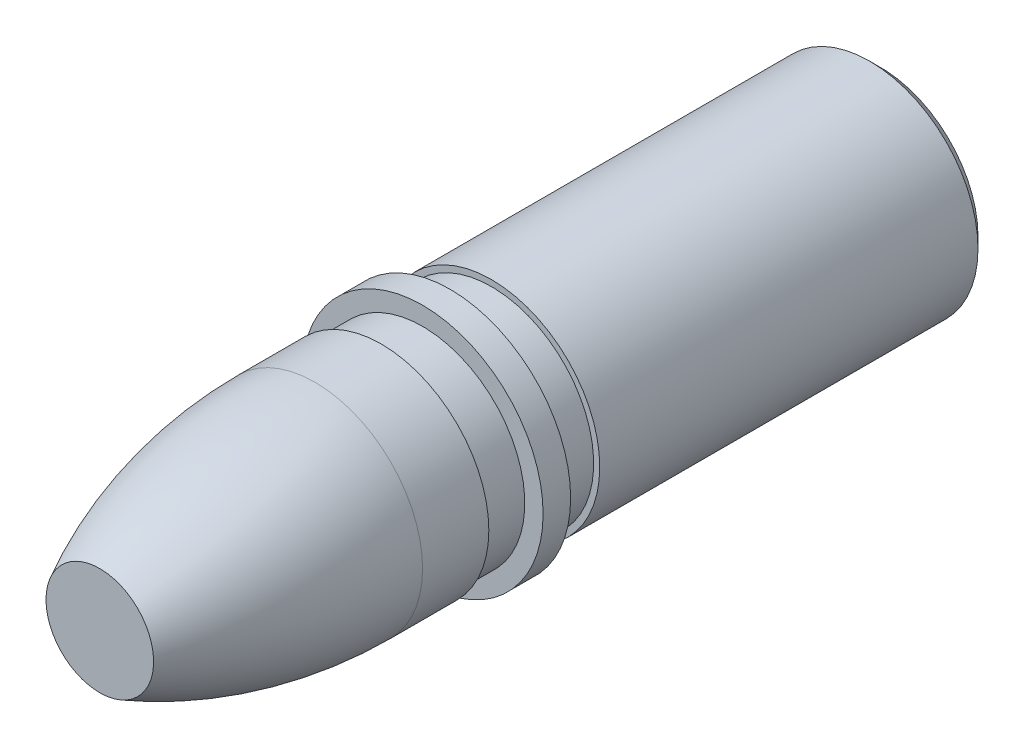
ISO-10303-21;
HEADER;
FILE_DESCRIPTION(('STEP AP214'),'2;1');
FILE_NAME('part.step','',(''),(''),'','','');
FILE_SCHEMA(('AUTOMOTIVE_DESIGN { 1 0 10303 214 1 1 1 1 }'));
ENDSEC;
DATA;
#1=APPLICATION_CONTEXT('core data for automotive mechanical design processes');
#2=APPLICATION_PROTOCOL_DEFINITION('international standard','automotive_design',2000,#1);
#3=PRODUCT_CONTEXT('',#1,'mechanical');
#4=PRODUCT('Part','Part','',(#3));
#5=PRODUCT_RELATED_PRODUCT_CATEGORY('part','',(#4));
#6=PRODUCT_DEFINITION_FORMATION('','',#4);
#7=PRODUCT_DEFINITION_CONTEXT('part definition',#1,'design');
#8=PRODUCT_DEFINITION('design','',#6,#7);
#9=PRODUCT_DEFINITION_SHAPE('','',#8);
#10=(LENGTH_UNIT() NAMED_UNIT(*) SI_UNIT(.MILLI.,.METRE.));
#11=(NAMED_UNIT(*) PLANE_ANGLE_UNIT() SI_UNIT($,.RADIAN.));
#12=(NAMED_UNIT(*) SI_UNIT($,.STERADIAN.) SOLID_ANGLE_UNIT());
#13=UNCERTAINTY_MEASURE_WITH_UNIT(LENGTH_MEASURE(1.E-05),#10,'distance_accuracy_value','');
#14=(GEOMETRIC_REPRESENTATION_CONTEXT(3) GLOBAL_UNCERTAINTY_ASSIGNED_CONTEXT((#13)) GLOBAL_UNIT_ASSIGNED_CONTEXT((#10,
#11,#12)) REPRESENTATION_CONTEXT('',''));
#15=CARTESIAN_POINT('',(0.,0.,0.));
#16=DIRECTION('',(0.,0.,1.));
#17=DIRECTION('',(1.,0.,0.));
#18=AXIS2_PLACEMENT_3D('',#15,#16,#17);
#19=CARTESIAN_POINT('',(0.,3.19532,-23.0378));
#20=DIRECTION('',(0.,0.,-1.));
#21=DIRECTION('',(-1.,0.,0.));
#22=AXIS2_PLACEMENT_3D('',#19,#20,#21);
#23=PLANE('',#22);
#24=CARTESIAN_POINT('',(0.,0.,-23.0378));
#25=DIRECTION('',(0.,0.,-1.));
#26=DIRECTION('',(-1.,0.,0.));
#27=AXIS2_PLACEMENT_3D('',#24,#25,#26);
#28=CIRCLE('',#27,2.875788);
#29=CARTESIAN_POINT('',(-2.875788,0.,-23.0378));
#30=VERTEX_POINT('',#29);
#31=EDGE_CURVE('E37',#30,#30,#28,.T.);
#32=ORIENTED_EDGE('',*,*,#31,.T.);
#33=EDGE_LOOP('',(#32));
#34=FACE_BOUND('',#33,.T.);
#35=ADVANCED_FACE('F30',(#34),#23,.T.);
#36=CARTESIAN_POINT('',(0.,0.,0.));
#37=DIRECTION('',(0.,0.,-1.));
#38=DIRECTION('',(-1.,0.,0.));
#39=AXIS2_PLACEMENT_3D('',#36,#37,#38);
#40=CYLINDRICAL_SURFACE('',#39,3.19532);
#41=CARTESIAN_POINT('',(0.,0.,-22.718268));
#42=DIRECTION('',(0.,0.,-1.));
#43=DIRECTION('',(-1.,0.,0.));
#44=AXIS2_PLACEMENT_3D('',#41,#42,#43);
#45=CIRCLE('',#44,3.19532);
#46=CARTESIAN_POINT('',(-3.19532,0.,-22.718268));
#47=VERTEX_POINT('',#46);
#48=EDGE_CURVE('E10',#47,#47,#45,.F.);
#49=ORIENTED_EDGE('',*,*,#48,.T.);
#50=EDGE_LOOP('',(#49));
#51=FACE_BOUND('',#50,.T.);
#52=CARTESIAN_POINT('',(0.,0.,-11.557));
#53=DIRECTION('',(0.,0.,-1.));
#54=DIRECTION('',(-1.,0.,0.));
#55=AXIS2_PLACEMENT_3D('',#52,#53,#54);
#56=CIRCLE('',#55,3.19532);
#57=CARTESIAN_POINT('',(-3.19532,0.,-11.557));
#58=VERTEX_POINT('',#57);
#59=EDGE_CURVE('E41',#58,#58,#56,.T.);
#60=ORIENTED_EDGE('',*,*,#59,.T.);
#61=EDGE_LOOP('',(#60));
#62=FACE_BOUND('',#61,.T.);
#63=ADVANCED_FACE('F89',(#51,#62),#40,.T.);
#64=CARTESIAN_POINT('',(0.,3.0150435,-11.557));
#65=DIRECTION('',(0.,0.,1.));
#66=DIRECTION('',(1.,0.,0.));
#67=AXIS2_PLACEMENT_3D('',#64,#65,#66);
#68=PLANE('',#67);
#69=CARTESIAN_POINT('',(0.,0.,-11.557));
#70=DIRECTION('',(0.,0.,-1.));
#71=DIRECTION('',(-1.,0.,0.));
#72=AXIS2_PLACEMENT_3D('',#69,#70,#71);
#73=CIRCLE('',#72,3.0150435);
#74=CARTESIAN_POINT('',(-3.0150435,0.,-11.557));
#75=VERTEX_POINT('',#74);
#76=EDGE_CURVE('E45',#75,#75,#73,.T.);
#77=ORIENTED_EDGE('',*,*,#76,.T.);
#78=EDGE_LOOP('',(#77));
#79=FACE_BOUND('',#78,.T.);
#80=ORIENTED_EDGE('',*,*,#59,.F.);
#81=EDGE_LOOP('',(#80));
#82=FACE_BOUND('',#81,.T.);
#83=ADVANCED_FACE('F93',(#79,#82),#68,.T.);
#84=CARTESIAN_POINT('',(0.,0.,0.));
#85=DIRECTION('',(0.,0.,-1.));
#86=DIRECTION('',(-1.,0.,0.));
#87=AXIS2_PLACEMENT_3D('',#84,#85,#86);
#88=CYLINDRICAL_SURFACE('',#87,3.0150435);
#89=CARTESIAN_POINT('',(0.,0.,-10.3378));
#90=DIRECTION('',(0.,0.,-1.));
#91=DIRECTION('',(-1.,0.,0.));
#92=AXIS2_PLACEMENT_3D('',#89,#90,#91);
#93=CIRCLE('',#92,3.0150435);
#94=CARTESIAN_POINT('',(-3.0150435,0.,-10.3378));
#95=VERTEX_POINT('',#94);
#96=EDGE_CURVE('E50',#95,#95,#93,.T.);
#97=ORIENTED_EDGE('',*,*,#96,.T.);
#98=EDGE_LOOP('',(#97));
#99=FACE_BOUND('',#98,.T.);
#100=ORIENTED_EDGE('',*,*,#76,.F.);
#101=EDGE_LOOP('',(#100));
#102=FACE_BOUND('',#101,.T.);
#103=ADVANCED_FACE('F98',(#99,#102),#88,.T.);
#104=CARTESIAN_POINT('',(0.,3.556,-10.3378));
#105=DIRECTION('',(0.,0.,-1.));
#106=DIRECTION('',(-1.,0.,0.));
#107=AXIS2_PLACEMENT_3D('',#104,#105,#106);
#108=PLANE('',#107);
#109=CARTESIAN_POINT('',(0.,0.,-10.3378));
#110=DIRECTION('',(0.,0.,-1.));
#111=DIRECTION('',(-1.,0.,0.));
#112=AXIS2_PLACEMENT_3D('',#109,#110,#111);
#113=CIRCLE('',#112,3.556);
#114=CARTESIAN_POINT('',(-3.556,0.,-10.3378));
#115=VERTEX_POINT('',#114);
#116=EDGE_CURVE('E53',#115,#115,#113,.T.);
#117=ORIENTED_EDGE('',*,*,#116,.T.);
#118=EDGE_LOOP('',(#117));
#119=FACE_BOUND('',#118,.T.);
#120=ORIENTED_EDGE('',*,*,#96,.F.);
#121=EDGE_LOOP('',(#120));
#122=FACE_BOUND('',#121,.T.);
#123=ADVANCED_FACE('F102',(#119,#122),#108,.T.);
#124=CARTESIAN_POINT('',(0.,0.,0.));
#125=DIRECTION('',(0.,0.,-1.));
#126=DIRECTION('',(-1.,0.,0.));
#127=AXIS2_PLACEMENT_3D('',#124,#125,#126);
#128=CYLINDRICAL_SURFACE('',#127,3.556);
#129=CARTESIAN_POINT('',(0.,0.,-9.525));
#130=DIRECTION('',(0.,0.,-1.));
#131=DIRECTION('',(-1.,0.,0.));
#132=AXIS2_PLACEMENT_3D('',#129,#130,#131);
#133=CIRCLE('',#132,3.556);
#134=CARTESIAN_POINT('',(-3.556,0.,-9.525));
#135=VERTEX_POINT('',#134);
#136=EDGE_CURVE('E56',#135,#135,#133,.T.);
#137=ORIENTED_EDGE('',*,*,#136,.T.);
#138=EDGE_LOOP('',(#137));
#139=FACE_BOUND('',#138,.T.);
#140=ORIENTED_EDGE('',*,*,#116,.F.);
#141=EDGE_LOOP('',(#140));
#142=FACE_BOUND('',#141,.T.);
#143=ADVANCED_FACE('F106',(#139,#142),#128,.T.);
#144=CARTESIAN_POINT('',(0.,3.0150435,-9.525));
#145=DIRECTION('',(0.,0.,1.));
#146=DIRECTION('',(1.,0.,0.));
#147=AXIS2_PLACEMENT_3D('',#144,#145,#146);
#148=PLANE('',#147);
#149=CARTESIAN_POINT('',(0.,0.,-9.525));
#150=DIRECTION('',(0.,0.,-1.));
#151=DIRECTION('',(-1.,0.,0.));
#152=AXIS2_PLACEMENT_3D('',#149,#150,#151);
#153=CIRCLE('',#152,3.0150435);
#154=CARTESIAN_POINT('',(-3.0150435,0.,-9.525));
#155=VERTEX_POINT('',#154);
#156=EDGE_CURVE('E59',#155,#155,#153,.T.);
#157=ORIENTED_EDGE('',*,*,#156,.T.);
#158=EDGE_LOOP('',(#157));
#159=FACE_BOUND('',#158,.T.);
#160=ORIENTED_EDGE('',*,*,#136,.F.);
#161=EDGE_LOOP('',(#160));
#162=FACE_BOUND('',#161,.T.);
#163=ADVANCED_FACE('F110',(#159,#162),#148,.T.);
#164=CARTESIAN_POINT('',(0.,0.,0.));
#165=DIRECTION('',(0.,0.,-1.));
#166=DIRECTION('',(-1.,0.,0.));
#167=AXIS2_PLACEMENT_3D('',#164,#165,#166);
#168=CYLINDRICAL_SURFACE('',#167,3.0150435);
#169=CARTESIAN_POINT('',(0.,0.,-8.3058));
#170=DIRECTION('',(0.,0.,-1.));
#171=DIRECTION('',(-1.,0.,0.));
#172=AXIS2_PLACEMENT_3D('',#169,#170,#171);
#173=CIRCLE('',#172,3.0150435);
#174=CARTESIAN_POINT('',(-3.0150435,0.,-8.3058));
#175=VERTEX_POINT('',#174);
#176=EDGE_CURVE('E62',#175,#175,#173,.T.);
#177=ORIENTED_EDGE('',*,*,#176,.T.);
#178=EDGE_LOOP('',(#177));
#179=FACE_BOUND('',#178,.T.);
#180=ORIENTED_EDGE('',*,*,#156,.F.);
#181=EDGE_LOOP('',(#180));
#182=FACE_BOUND('',#181,.T.);
#183=ADVANCED_FACE('F114',(#179,#182),#168,.T.);
#184=CARTESIAN_POINT('',(0.,3.0150435,-8.3058));
#185=DIRECTION('',(0.,0.,-1.));
#186=DIRECTION('',(-1.,0.,0.));
#187=AXIS2_PLACEMENT_3D('',#184,#185,#186);
#188=PLANE('',#187);
#189=CARTESIAN_POINT('',(0.,0.,-8.3058));
#190=DIRECTION('',(0.,0.,-1.));
#191=DIRECTION('',(-1.,0.,0.));
#192=AXIS2_PLACEMENT_3D('',#189,#190,#191);
#193=CIRCLE('',#192,3.17373);
#194=CARTESIAN_POINT('',(-3.17373,0.,-8.3058));
#195=VERTEX_POINT('',#194);
#196=EDGE_CURVE('E65',#195,#195,#193,.T.);
#197=ORIENTED_EDGE('',*,*,#196,.T.);
#198=EDGE_LOOP('',(#197));
#199=FACE_BOUND('',#198,.T.);
#200=ORIENTED_EDGE('',*,*,#176,.F.);
#201=EDGE_LOOP('',(#200));
#202=FACE_BOUND('',#201,.T.);
#203=ADVANCED_FACE('F118',(#199,#202),#188,.T.);
#204=CARTESIAN_POINT('',(0.,0.,0.));
#205=DIRECTION('',(0.,0.,-1.));
#206=DIRECTION('',(-1.,0.,0.));
#207=AXIS2_PLACEMENT_3D('',#204,#205,#206);
#208=CYLINDRICAL_SURFACE('',#207,3.17373);
#209=CARTESIAN_POINT('',(0.,0.,-6.35));
#210=DIRECTION('',(0.,0.,-1.));
#211=DIRECTION('',(-1.,0.,0.));
#212=AXIS2_PLACEMENT_3D('',#209,#210,#211);
#213=CIRCLE('',#212,3.17373);
#214=CARTESIAN_POINT('',(-3.17373,0.,-6.35));
#215=VERTEX_POINT('',#214);
#216=EDGE_CURVE('E68',#215,#215,#213,.T.);
#217=ORIENTED_EDGE('',*,*,#216,.T.);
#218=EDGE_LOOP('',(#217));
#219=FACE_BOUND('',#218,.T.);
#220=ORIENTED_EDGE('',*,*,#196,.F.);
#221=EDGE_LOOP('',(#220));
#222=FACE_BOUND('',#221,.T.);
#223=ADVANCED_FACE('F86',(#219,#222),#208,.T.);
#224=CARTESIAN_POINT('',(0.,0.,-6.35));
#225=DIRECTION('',(0.,0.,-1.));
#226=DIRECTION('',(-1.,0.,0.));
#227=AXIS2_PLACEMENT_3D('',#224,#225,#226);
#228=DEGENERATE_TOROIDAL_SURFACE('',#227,10.3295531345076,13.5032831345076,.F.);
#229=CARTESIAN_POINT('',(0.,0.,0.));
#230=DIRECTION('',(0.,0.,-1.));
#231=DIRECTION('',(-1.,0.,0.));
#232=AXIS2_PLACEMENT_3D('',#229,#230,#231);
#233=CIRCLE('',#232,1.5875);
#234=CARTESIAN_POINT('',(-1.5875,0.,0.));
#235=VERTEX_POINT('',#234);
#236=EDGE_CURVE('E71',#235,#235,#233,.T.);
#237=ORIENTED_EDGE('',*,*,#236,.T.);
#238=EDGE_LOOP('',(#237));
#239=FACE_BOUND('',#238,.T.);
#240=ORIENTED_EDGE('',*,*,#216,.F.);
#241=EDGE_LOOP('',(#240));
#242=FACE_BOUND('',#241,.T.);
#243=ADVANCED_FACE('F75',(#239,#242),#228,.F.);
#244=CARTESIAN_POINT('',(0.,0.,0.));
#245=DIRECTION('',(0.,0.,1.));
#246=DIRECTION('',(1.,0.,0.));
#247=AXIS2_PLACEMENT_3D('',#244,#245,#246);
#248=PLANE('',#247);
#249=ORIENTED_EDGE('',*,*,#236,.F.);
#250=EDGE_LOOP('',(#249));
#251=FACE_BOUND('',#250,.T.);
#252=ADVANCED_FACE('F78',(#251),#248,.T.);
#253=CARTESIAN_POINT('',(0.,0.,-23.0378));
#254=DIRECTION('',(0.,0.,1.));
#255=DIRECTION('',(1.,0.,0.));
#256=AXIS2_PLACEMENT_3D('',#253,#254,#255);
#257=CONICAL_SURFACE('',#256,2.875788,0.785398163397449);
#258=ORIENTED_EDGE('',*,*,#48,.F.);
#259=EDGE_LOOP('',(#258));
#260=FACE_BOUND('',#259,.T.);
#261=ORIENTED_EDGE('',*,*,#31,.F.);
#262=EDGE_LOOP('',(#261));
#263=FACE_BOUND('',#262,.T.);
#264=ADVANCED_FACE('F32',(#260,#263),#257,.T.);
#265=CLOSED_SHELL('',(#35,#63,#83,#103,#123,#143,#163,#183,#203,#223,#243,#252,#264));
#266=MANIFOLD_SOLID_BREP('B2',#265);
#267=ADVANCED_BREP_SHAPE_REPRESENTATION('',(#18,#266),#14);
#268=SHAPE_DEFINITION_REPRESENTATION(#9,#267);
ENDSEC;
END-ISO-10303-21;
